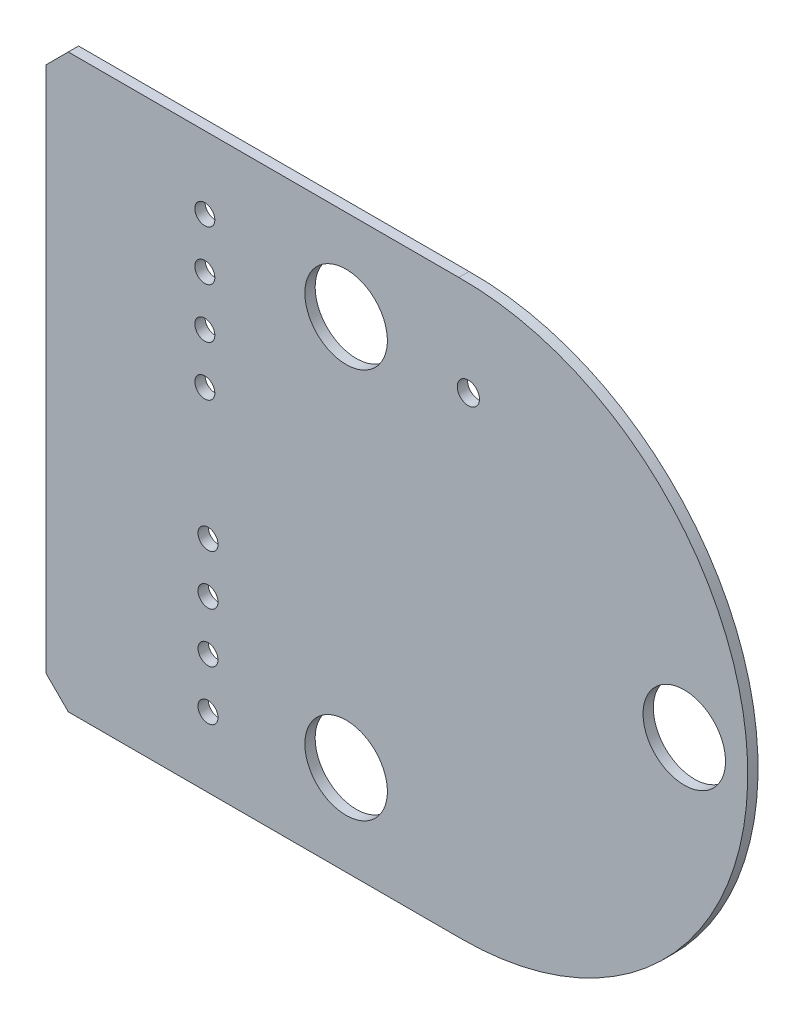
ISO-10303-21;
HEADER;
FILE_DESCRIPTION(('STEP AP214'),'2;1');
FILE_NAME('part.step','',(''),(''),'','','');
FILE_SCHEMA(('AUTOMOTIVE_DESIGN { 1 0 10303 214 1 1 1 1 }'));
ENDSEC;
DATA;
#1=APPLICATION_CONTEXT('core data for automotive mechanical design processes');
#2=APPLICATION_PROTOCOL_DEFINITION('international standard','automotive_design',2000,#1);
#3=PRODUCT_CONTEXT('',#1,'mechanical');
#4=PRODUCT('Part','Part','',(#3));
#5=PRODUCT_RELATED_PRODUCT_CATEGORY('part','',(#4));
#6=PRODUCT_DEFINITION_FORMATION('','',#4);
#7=PRODUCT_DEFINITION_CONTEXT('part definition',#1,'design');
#8=PRODUCT_DEFINITION('design','',#6,#7);
#9=PRODUCT_DEFINITION_SHAPE('','',#8);
#10=(LENGTH_UNIT() NAMED_UNIT(*) SI_UNIT(.MILLI.,.METRE.));
#11=(NAMED_UNIT(*) PLANE_ANGLE_UNIT() SI_UNIT($,.RADIAN.));
#12=(NAMED_UNIT(*) SI_UNIT($,.STERADIAN.) SOLID_ANGLE_UNIT());
#13=UNCERTAINTY_MEASURE_WITH_UNIT(LENGTH_MEASURE(1.E-05),#10,'distance_accuracy_value','');
#14=(GEOMETRIC_REPRESENTATION_CONTEXT(3) GLOBAL_UNCERTAINTY_ASSIGNED_CONTEXT((#13)) GLOBAL_UNIT_ASSIGNED_CONTEXT((#10,
#11,#12)) REPRESENTATION_CONTEXT('',''));
#15=CARTESIAN_POINT('',(0.,0.,0.));
#16=DIRECTION('',(0.,0.,1.));
#17=DIRECTION('',(1.,0.,0.));
#18=AXIS2_PLACEMENT_3D('',#15,#16,#17);
#19=CARTESIAN_POINT('',(78.105,54.229,0.41148));
#20=DIRECTION('',(0.,0.,-1.));
#21=DIRECTION('',(-1.,0.,0.));
#22=AXIS2_PLACEMENT_3D('',#19,#20,#21);
#23=PLANE('',#22);
#24=CARTESIAN_POINT('',(94.996,72.39,0.41148));
#25=DIRECTION('',(0.,0.,-1.));
#26=DIRECTION('',(-1.,0.,0.));
#27=AXIS2_PLACEMENT_3D('',#24,#25,#26);
#28=CIRCLE('',#27,0.4445);
#29=CARTESIAN_POINT('',(94.5515,72.39,0.41148));
#30=VERTEX_POINT('',#29);
#31=EDGE_CURVE('E124',#30,#30,#28,.T.);
#32=ORIENTED_EDGE('',*,*,#31,.T.);
#33=EDGE_LOOP('',(#32));
#34=FACE_BOUND('',#33,.T.);
#35=CARTESIAN_POINT('',(103.632,64.77,0.41148));
#36=DIRECTION('',(0.,0.,-1.));
#37=DIRECTION('',(-1.,0.,0.));
#38=AXIS2_PLACEMENT_3D('',#35,#36,#37);
#39=CIRCLE('',#38,1.64999924);
#40=CARTESIAN_POINT('',(101.98200076,64.77,0.41148));
#41=VERTEX_POINT('',#40);
#42=EDGE_CURVE('E178',#41,#41,#39,.T.);
#43=ORIENTED_EDGE('',*,*,#42,.T.);
#44=EDGE_LOOP('',(#43));
#45=FACE_BOUND('',#44,.T.);
#46=CARTESIAN_POINT('',(90.1065,72.5789506,0.41148));
#47=DIRECTION('',(0.,0.,-1.));
#48=DIRECTION('',(-1.,0.,0.));
#49=AXIS2_PLACEMENT_3D('',#46,#47,#48);
#50=CIRCLE('',#49,1.64999924);
#51=CARTESIAN_POINT('',(88.45650076,72.5789506,0.41148));
#52=VERTEX_POINT('',#51);
#53=EDGE_CURVE('E181',#52,#52,#50,.T.);
#54=ORIENTED_EDGE('',*,*,#53,.T.);
#55=EDGE_LOOP('',(#54));
#56=FACE_BOUND('',#55,.T.);
#57=CARTESIAN_POINT('',(84.582,60.133992,0.41148));
#58=DIRECTION('',(0.,0.,-1.));
#59=DIRECTION('',(-1.,0.,0.));
#60=AXIS2_PLACEMENT_3D('',#57,#58,#59);
#61=CIRCLE('',#60,0.3999992);
#62=CARTESIAN_POINT('',(84.1820008,60.133992,0.41148));
#63=VERTEX_POINT('',#62);
#64=EDGE_CURVE('E184',#63,#63,#61,.T.);
#65=ORIENTED_EDGE('',*,*,#64,.T.);
#66=EDGE_LOOP('',(#65));
#67=FACE_BOUND('',#66,.T.);
#68=CARTESIAN_POINT('',(90.1065,56.9610494,0.41148));
#69=DIRECTION('',(0.,0.,-1.));
#70=DIRECTION('',(-1.,0.,0.));
#71=AXIS2_PLACEMENT_3D('',#68,#69,#70);
#72=CIRCLE('',#71,1.64999924);
#73=CARTESIAN_POINT('',(88.45650076,56.9610494,0.41148));
#74=VERTEX_POINT('',#73);
#75=EDGE_CURVE('E187',#74,#74,#72,.T.);
#76=ORIENTED_EDGE('',*,*,#75,.T.);
#77=EDGE_LOOP('',(#76));
#78=FACE_BOUND('',#77,.T.);
#79=CARTESIAN_POINT('',(84.582,62.133988,0.41148));
#80=DIRECTION('',(0.,0.,-1.));
#81=DIRECTION('',(-1.,0.,0.));
#82=AXIS2_PLACEMENT_3D('',#79,#80,#81);
#83=CIRCLE('',#82,0.3999992);
#84=CARTESIAN_POINT('',(84.1820008,62.133988,0.41148));
#85=VERTEX_POINT('',#84);
#86=EDGE_CURVE('E190',#85,#85,#83,.T.);
#87=ORIENTED_EDGE('',*,*,#86,.T.);
#88=EDGE_LOOP('',(#87));
#89=FACE_BOUND('',#88,.T.);
#90=CARTESIAN_POINT('',(84.455,71.309992,0.41148));
#91=DIRECTION('',(0.,0.,-1.));
#92=DIRECTION('',(-1.,0.,0.));
#93=AXIS2_PLACEMENT_3D('',#90,#91,#92);
#94=CIRCLE('',#93,0.3999992);
#95=CARTESIAN_POINT('',(84.0550008,71.309992,0.41148));
#96=VERTEX_POINT('',#95);
#97=EDGE_CURVE('E193',#96,#96,#94,.T.);
#98=ORIENTED_EDGE('',*,*,#97,.T.);
#99=EDGE_LOOP('',(#98));
#100=FACE_BOUND('',#99,.T.);
#101=CARTESIAN_POINT('',(84.455,69.309996,0.41148));
#102=DIRECTION('',(0.,0.,-1.));
#103=DIRECTION('',(-1.,0.,0.));
#104=AXIS2_PLACEMENT_3D('',#101,#102,#103);
#105=CIRCLE('',#104,0.3999992);
#106=CARTESIAN_POINT('',(84.0550008,69.309996,0.41148));
#107=VERTEX_POINT('',#106);
#108=EDGE_CURVE('E196',#107,#107,#105,.T.);
#109=ORIENTED_EDGE('',*,*,#108,.T.);
#110=EDGE_LOOP('',(#109));
#111=FACE_BOUND('',#110,.T.);
#112=CARTESIAN_POINT('',(84.455,73.309988,0.41148));
#113=DIRECTION('',(0.,0.,-1.));
#114=DIRECTION('',(-1.,0.,0.));
#115=AXIS2_PLACEMENT_3D('',#112,#113,#114);
#116=CIRCLE('',#115,0.3999992);
#117=CARTESIAN_POINT('',(84.0550008,73.309988,0.41148));
#118=VERTEX_POINT('',#117);
#119=EDGE_CURVE('E199',#118,#118,#116,.T.);
#120=ORIENTED_EDGE('',*,*,#119,.T.);
#121=EDGE_LOOP('',(#120));
#122=FACE_BOUND('',#121,.T.);
#123=CARTESIAN_POINT('',(84.582,58.133996,0.41148));
#124=DIRECTION('',(0.,0.,-1.));
#125=DIRECTION('',(-1.,0.,0.));
#126=AXIS2_PLACEMENT_3D('',#123,#124,#125);
#127=CIRCLE('',#126,0.3999992);
#128=CARTESIAN_POINT('',(84.1820008,58.133996,0.41148));
#129=VERTEX_POINT('',#128);
#130=EDGE_CURVE('E202',#129,#129,#127,.T.);
#131=ORIENTED_EDGE('',*,*,#130,.T.);
#132=EDGE_LOOP('',(#131));
#133=FACE_BOUND('',#132,.T.);
#134=CARTESIAN_POINT('',(84.582,56.134,0.41148));
#135=DIRECTION('',(0.,0.,-1.));
#136=DIRECTION('',(-1.,0.,0.));
#137=AXIS2_PLACEMENT_3D('',#134,#135,#136);
#138=CIRCLE('',#137,0.3999992);
#139=CARTESIAN_POINT('',(84.1820008,56.134,0.41148));
#140=VERTEX_POINT('',#139);
#141=EDGE_CURVE('E205',#140,#140,#138,.T.);
#142=ORIENTED_EDGE('',*,*,#141,.T.);
#143=EDGE_LOOP('',(#142));
#144=FACE_BOUND('',#143,.T.);
#145=CARTESIAN_POINT('',(84.455,67.31,0.41148));
#146=DIRECTION('',(0.,0.,-1.));
#147=DIRECTION('',(-1.,0.,0.));
#148=AXIS2_PLACEMENT_3D('',#145,#146,#147);
#149=CIRCLE('',#148,0.3999992);
#150=CARTESIAN_POINT('',(84.0550008,67.31,0.41148));
#151=VERTEX_POINT('',#150);
#152=EDGE_CURVE('E101',#151,#151,#149,.T.);
#153=ORIENTED_EDGE('',*,*,#152,.T.);
#154=EDGE_LOOP('',(#153));
#155=FACE_BOUND('',#154,.T.);
#156=DIRECTION('',(1.,0.,0.));
#157=VECTOR('',#156,1.);
#158=CARTESIAN_POINT('',(78.994,53.34,0.41148));
#159=LINE('',#158,#157);
#160=CARTESIAN_POINT('',(78.994,53.34,0.41148));
#161=VERTEX_POINT('',#160);
#162=CARTESIAN_POINT('',(94.7420030007095,53.34,0.41148));
#163=VERTEX_POINT('',#162);
#164=EDGE_CURVE('E70',#161,#163,#159,.T.);
#165=ORIENTED_EDGE('',*,*,#164,.T.);
#166=CARTESIAN_POINT('',(94.742006001419,64.769993001131,0.41148));
#167=DIRECTION('',(0.,0.,-1.));
#168=DIRECTION('',(-1.,0.,0.));
#169=AXIS2_PLACEMENT_3D('',#166,#167,#168);
#170=CIRCLE('',#169,11.429993001133);
#171=CARTESIAN_POINT('',(94.6157619999793,76.1992888000002,0.41148));
#172=VERTEX_POINT('',#171);
#173=EDGE_CURVE('E19',#172,#163,#170,.T.);
#174=ORIENTED_EDGE('',*,*,#173,.F.);
#175=DIRECTION('',(1.,0.,0.));
#176=VECTOR('',#175,1.);
#177=CARTESIAN_POINT('',(94.615762,76.1992888,0.41148));
#178=LINE('',#177,#176);
#179=CARTESIAN_POINT('',(78.9932888,76.1992888,0.41148));
#180=VERTEX_POINT('',#179);
#181=EDGE_CURVE('E66',#172,#180,#178,.F.);
#182=ORIENTED_EDGE('',*,*,#181,.T.);
#183=DIRECTION('',(0.707106781186548,0.707106781186548,0.));
#184=VECTOR('',#183,1.);
#185=CARTESIAN_POINT('',(78.9932888,76.1992888,0.41148));
#186=LINE('',#185,#184);
#187=CARTESIAN_POINT('',(78.105,75.311,0.41148));
#188=VERTEX_POINT('',#187);
#189=EDGE_CURVE('E118',#180,#188,#186,.F.);
#190=ORIENTED_EDGE('',*,*,#189,.T.);
#191=DIRECTION('',(0.,1.,0.));
#192=VECTOR('',#191,1.);
#193=CARTESIAN_POINT('',(78.105,75.311,0.41148));
#194=LINE('',#193,#192);
#195=CARTESIAN_POINT('',(78.105,54.229,0.41148));
#196=VERTEX_POINT('',#195);
#197=EDGE_CURVE('E119',#188,#196,#194,.F.);
#198=ORIENTED_EDGE('',*,*,#197,.T.);
#199=DIRECTION('',(-0.707106781186548,0.707106781186548,0.));
#200=VECTOR('',#199,1.);
#201=CARTESIAN_POINT('',(78.105,54.229,0.41148));
#202=LINE('',#201,#200);
#203=EDGE_CURVE('E74',#196,#161,#202,.F.);
#204=ORIENTED_EDGE('',*,*,#203,.T.);
#205=EDGE_LOOP('',(#165,#174,#182,#190,#198,#204));
#206=FACE_BOUND('',#205,.T.);
#207=ADVANCED_FACE('F16',(#34,#45,#56,#67,#78,#89,#100,#111,#122,#133,#144,#155,#206),#23,.F.);
#208=CARTESIAN_POINT('',(78.105,75.311,0.));
#209=DIRECTION('',(1.,0.,0.));
#210=DIRECTION('',(0.,0.,-1.));
#211=AXIS2_PLACEMENT_3D('',#208,#209,#210);
#212=PLANE('',#211);
#213=DIRECTION('',(0.,0.,1.));
#214=VECTOR('',#213,1.);
#215=CARTESIAN_POINT('',(78.105,54.229,0.));
#216=LINE('',#215,#214);
#217=CARTESIAN_POINT('',(78.105,54.229,0.));
#218=VERTEX_POINT('',#217);
#219=EDGE_CURVE('E86',#218,#196,#216,.T.);
#220=ORIENTED_EDGE('',*,*,#219,.T.);
#221=ORIENTED_EDGE('',*,*,#197,.F.);
#222=DIRECTION('',(0.,0.,1.));
#223=VECTOR('',#222,1.);
#224=CARTESIAN_POINT('',(78.105,75.311,0.));
#225=LINE('',#224,#223);
#226=CARTESIAN_POINT('',(78.105,75.311,0.));
#227=VERTEX_POINT('',#226);
#228=EDGE_CURVE('E116',#188,#227,#225,.F.);
#229=ORIENTED_EDGE('',*,*,#228,.T.);
#230=DIRECTION('',(0.,1.,0.));
#231=VECTOR('',#230,1.);
#232=CARTESIAN_POINT('',(78.105,54.229,0.));
#233=LINE('',#232,#231);
#234=EDGE_CURVE('E113',#218,#227,#233,.T.);
#235=ORIENTED_EDGE('',*,*,#234,.F.);
#236=EDGE_LOOP('',(#220,#221,#229,#235));
#237=FACE_BOUND('',#236,.T.);
#238=ADVANCED_FACE('F238',(#237),#212,.F.);
#239=CARTESIAN_POINT('',(78.9932888,76.1992888,0.));
#240=DIRECTION('',(0.707106781186548,-0.707106781186548,0.));
#241=DIRECTION('',(0.707106781186548,0.707106781186548,0.));
#242=AXIS2_PLACEMENT_3D('',#239,#240,#241);
#243=PLANE('',#242);
#244=DIRECTION('',(0.,0.,-1.));
#245=VECTOR('',#244,1.);
#246=CARTESIAN_POINT('',(78.9932888,76.1992888,0.));
#247=LINE('',#246,#245);
#248=CARTESIAN_POINT('',(78.9932888,76.1992888,0.));
#249=VERTEX_POINT('',#248);
#250=EDGE_CURVE('E105',#180,#249,#247,.T.);
#251=ORIENTED_EDGE('',*,*,#250,.T.);
#252=DIRECTION('',(0.70710678118654,0.707106781186555,0.));
#253=VECTOR('',#252,1.);
#254=CARTESIAN_POINT('',(78.105,75.311,0.));
#255=LINE('',#254,#253);
#256=EDGE_CURVE('E110',#227,#249,#255,.T.);
#257=ORIENTED_EDGE('',*,*,#256,.F.);
#258=ORIENTED_EDGE('',*,*,#228,.F.);
#259=ORIENTED_EDGE('',*,*,#189,.F.);
#260=EDGE_LOOP('',(#251,#257,#258,#259));
#261=FACE_BOUND('',#260,.T.);
#262=ADVANCED_FACE('F234',(#261),#243,.F.);
#263=CARTESIAN_POINT('',(94.615762,76.1992888,0.));
#264=DIRECTION('',(0.,-1.,0.));
#265=DIRECTION('',(0.,0.,-1.));
#266=AXIS2_PLACEMENT_3D('',#263,#264,#265);
#267=PLANE('',#266);
#268=ORIENTED_EDGE('',*,*,#250,.F.);
#269=ORIENTED_EDGE('',*,*,#181,.F.);
#270=DIRECTION('',(0.,0.,-1.));
#271=VECTOR('',#270,1.);
#272=CARTESIAN_POINT('',(94.615762,76.1992888000005,0.));
#273=LINE('',#272,#271);
#274=CARTESIAN_POINT('',(94.6157619999793,76.1992888000002,0.));
#275=VERTEX_POINT('',#274);
#276=EDGE_CURVE('E81',#275,#172,#273,.F.);
#277=ORIENTED_EDGE('',*,*,#276,.F.);
#278=DIRECTION('',(-1.,0.,0.));
#279=VECTOR('',#278,1.);
#280=CARTESIAN_POINT('',(78.105,76.1992888,0.));
#281=LINE('',#280,#279);
#282=EDGE_CURVE('E112',#249,#275,#281,.F.);
#283=ORIENTED_EDGE('',*,*,#282,.F.);
#284=EDGE_LOOP('',(#268,#269,#277,#283));
#285=FACE_BOUND('',#284,.T.);
#286=ADVANCED_FACE('F231',(#285),#267,.F.);
#287=CARTESIAN_POINT('',(94.742006001419,64.769993001131,0.));
#288=DIRECTION('',(0.,0.,-1.));
#289=DIRECTION('',(-1.,0.,0.));
#290=AXIS2_PLACEMENT_3D('',#287,#288,#289);
#291=CYLINDRICAL_SURFACE('',#290,11.429993001133);
#292=ORIENTED_EDGE('',*,*,#173,.T.);
#293=DIRECTION('',(0.,0.,1.));
#294=VECTOR('',#293,1.);
#295=CARTESIAN_POINT('',(94.742,53.34,0.));
#296=LINE('',#295,#294);
#297=CARTESIAN_POINT('',(94.7420030007095,53.34,0.));
#298=VERTEX_POINT('',#297);
#299=EDGE_CURVE('E76',#163,#298,#296,.F.);
#300=ORIENTED_EDGE('',*,*,#299,.T.);
#301=CARTESIAN_POINT('',(94.742006001419,64.769993001131,0.));
#302=DIRECTION('',(0.,0.,-1.));
#303=DIRECTION('',(-1.,0.,0.));
#304=AXIS2_PLACEMENT_3D('',#301,#302,#303);
#305=CIRCLE('',#304,11.429993001133);
#306=EDGE_CURVE('E174',#275,#298,#305,.T.);
#307=ORIENTED_EDGE('',*,*,#306,.F.);
#308=ORIENTED_EDGE('',*,*,#276,.T.);
#309=EDGE_LOOP('',(#292,#300,#307,#308));
#310=FACE_BOUND('',#309,.T.);
#311=ADVANCED_FACE('F79',(#310),#291,.T.);
#312=CARTESIAN_POINT('',(78.994,53.34,0.));
#313=DIRECTION('',(0.,1.,0.));
#314=DIRECTION('',(0.,0.,1.));
#315=AXIS2_PLACEMENT_3D('',#312,#313,#314);
#316=PLANE('',#315);
#317=ORIENTED_EDGE('',*,*,#299,.F.);
#318=ORIENTED_EDGE('',*,*,#164,.F.);
#319=DIRECTION('',(0.,0.,1.));
#320=VECTOR('',#319,1.);
#321=CARTESIAN_POINT('',(78.994,53.34,0.));
#322=LINE('',#321,#320);
#323=CARTESIAN_POINT('',(78.994,53.34,0.));
#324=VERTEX_POINT('',#323);
#325=EDGE_CURVE('E34',#161,#324,#322,.F.);
#326=ORIENTED_EDGE('',*,*,#325,.T.);
#327=DIRECTION('',(-1.,0.,0.));
#328=VECTOR('',#327,1.);
#329=CARTESIAN_POINT('',(78.105,53.34,0.));
#330=LINE('',#329,#328);
#331=EDGE_CURVE('E84',#298,#324,#330,.T.);
#332=ORIENTED_EDGE('',*,*,#331,.F.);
#333=EDGE_LOOP('',(#317,#318,#326,#332));
#334=FACE_BOUND('',#333,.T.);
#335=ADVANCED_FACE('F82',(#334),#316,.F.);
#336=CARTESIAN_POINT('',(78.105,54.229,0.));
#337=DIRECTION('',(0.707106781186548,0.707106781186548,0.));
#338=DIRECTION('',(-0.707106781186548,0.707106781186548,0.));
#339=AXIS2_PLACEMENT_3D('',#336,#337,#338);
#340=PLANE('',#339);
#341=ORIENTED_EDGE('',*,*,#325,.F.);
#342=ORIENTED_EDGE('',*,*,#203,.F.);
#343=ORIENTED_EDGE('',*,*,#219,.F.);
#344=DIRECTION('',(-0.707106781186545,0.70710678118655,0.));
#345=VECTOR('',#344,1.);
#346=CARTESIAN_POINT('',(78.994,53.34,0.));
#347=LINE('',#346,#345);
#348=EDGE_CURVE('E94',#324,#218,#347,.T.);
#349=ORIENTED_EDGE('',*,*,#348,.F.);
#350=EDGE_LOOP('',(#341,#342,#343,#349));
#351=FACE_BOUND('',#350,.T.);
#352=ADVANCED_FACE('F215',(#351),#340,.F.);
#353=CARTESIAN_POINT('',(84.455,67.31,0.));
#354=DIRECTION('',(0.,0.,-1.));
#355=DIRECTION('',(-1.,0.,0.));
#356=AXIS2_PLACEMENT_3D('',#353,#354,#355);
#357=CYLINDRICAL_SURFACE('',#356,0.3999992);
#358=ORIENTED_EDGE('',*,*,#152,.F.);
#359=EDGE_LOOP('',(#358));
#360=FACE_BOUND('',#359,.T.);
#361=CARTESIAN_POINT('',(84.455,67.31,0.));
#362=DIRECTION('',(0.,0.,-1.));
#363=DIRECTION('',(-1.,0.,0.));
#364=AXIS2_PLACEMENT_3D('',#361,#362,#363);
#365=CIRCLE('',#364,0.3999992);
#366=CARTESIAN_POINT('',(84.0550008,67.31,0.));
#367=VERTEX_POINT('',#366);
#368=EDGE_CURVE('E97',#367,#367,#365,.F.);
#369=ORIENTED_EDGE('',*,*,#368,.F.);
#370=EDGE_LOOP('',(#369));
#371=FACE_BOUND('',#370,.T.);
#372=ADVANCED_FACE('F211',(#360,#371),#357,.F.);
#373=CARTESIAN_POINT('',(84.582,56.134,0.));
#374=DIRECTION('',(0.,0.,-1.));
#375=DIRECTION('',(-1.,0.,0.));
#376=AXIS2_PLACEMENT_3D('',#373,#374,#375);
#377=CYLINDRICAL_SURFACE('',#376,0.3999992);
#378=ORIENTED_EDGE('',*,*,#141,.F.);
#379=EDGE_LOOP('',(#378));
#380=FACE_BOUND('',#379,.T.);
#381=CARTESIAN_POINT('',(84.582,56.134,0.));
#382=DIRECTION('',(0.,0.,-1.));
#383=DIRECTION('',(-1.,0.,0.));
#384=AXIS2_PLACEMENT_3D('',#381,#382,#383);
#385=CIRCLE('',#384,0.3999992);
#386=CARTESIAN_POINT('',(84.1820008,56.134,0.));
#387=VERTEX_POINT('',#386);
#388=EDGE_CURVE('E169',#387,#387,#385,.F.);
#389=ORIENTED_EDGE('',*,*,#388,.F.);
#390=EDGE_LOOP('',(#389));
#391=FACE_BOUND('',#390,.T.);
#392=ADVANCED_FACE('F214',(#380,#391),#377,.F.);
#393=CARTESIAN_POINT('',(84.582,58.133996,0.));
#394=DIRECTION('',(0.,0.,-1.));
#395=DIRECTION('',(-1.,0.,0.));
#396=AXIS2_PLACEMENT_3D('',#393,#394,#395);
#397=CYLINDRICAL_SURFACE('',#396,0.3999992);
#398=ORIENTED_EDGE('',*,*,#130,.F.);
#399=EDGE_LOOP('',(#398));
#400=FACE_BOUND('',#399,.T.);
#401=CARTESIAN_POINT('',(84.582,58.133996,0.));
#402=DIRECTION('',(0.,0.,-1.));
#403=DIRECTION('',(-1.,0.,0.));
#404=AXIS2_PLACEMENT_3D('',#401,#402,#403);
#405=CIRCLE('',#404,0.3999992);
#406=CARTESIAN_POINT('',(84.1820008,58.133996,0.));
#407=VERTEX_POINT('',#406);
#408=EDGE_CURVE('E166',#407,#407,#405,.F.);
#409=ORIENTED_EDGE('',*,*,#408,.F.);
#410=EDGE_LOOP('',(#409));
#411=FACE_BOUND('',#410,.T.);
#412=ADVANCED_FACE('F286',(#400,#411),#397,.F.);
#413=CARTESIAN_POINT('',(84.455,73.309988,0.));
#414=DIRECTION('',(0.,0.,-1.));
#415=DIRECTION('',(-1.,0.,0.));
#416=AXIS2_PLACEMENT_3D('',#413,#414,#415);
#417=CYLINDRICAL_SURFACE('',#416,0.3999992);
#418=ORIENTED_EDGE('',*,*,#119,.F.);
#419=EDGE_LOOP('',(#418));
#420=FACE_BOUND('',#419,.T.);
#421=CARTESIAN_POINT('',(84.455,73.309988,0.));
#422=DIRECTION('',(0.,0.,-1.));
#423=DIRECTION('',(-1.,0.,0.));
#424=AXIS2_PLACEMENT_3D('',#421,#422,#423);
#425=CIRCLE('',#424,0.3999992);
#426=CARTESIAN_POINT('',(84.0550008,73.309988,0.));
#427=VERTEX_POINT('',#426);
#428=EDGE_CURVE('E163',#427,#427,#425,.F.);
#429=ORIENTED_EDGE('',*,*,#428,.F.);
#430=EDGE_LOOP('',(#429));
#431=FACE_BOUND('',#430,.T.);
#432=ADVANCED_FACE('F292',(#420,#431),#417,.F.);
#433=CARTESIAN_POINT('',(84.455,69.309996,0.));
#434=DIRECTION('',(0.,0.,-1.));
#435=DIRECTION('',(-1.,0.,0.));
#436=AXIS2_PLACEMENT_3D('',#433,#434,#435);
#437=CYLINDRICAL_SURFACE('',#436,0.3999992);
#438=ORIENTED_EDGE('',*,*,#108,.F.);
#439=EDGE_LOOP('',(#438));
#440=FACE_BOUND('',#439,.T.);
#441=CARTESIAN_POINT('',(84.455,69.309996,0.));
#442=DIRECTION('',(0.,0.,-1.));
#443=DIRECTION('',(-1.,0.,0.));
#444=AXIS2_PLACEMENT_3D('',#441,#442,#443);
#445=CIRCLE('',#444,0.3999992);
#446=CARTESIAN_POINT('',(84.0550008,69.309996,0.));
#447=VERTEX_POINT('',#446);
#448=EDGE_CURVE('E160',#447,#447,#445,.F.);
#449=ORIENTED_EDGE('',*,*,#448,.F.);
#450=EDGE_LOOP('',(#449));
#451=FACE_BOUND('',#450,.T.);
#452=ADVANCED_FACE('F298',(#440,#451),#437,.F.);
#453=CARTESIAN_POINT('',(84.455,71.309992,0.));
#454=DIRECTION('',(0.,0.,-1.));
#455=DIRECTION('',(-1.,0.,0.));
#456=AXIS2_PLACEMENT_3D('',#453,#454,#455);
#457=CYLINDRICAL_SURFACE('',#456,0.3999992);
#458=ORIENTED_EDGE('',*,*,#97,.F.);
#459=EDGE_LOOP('',(#458));
#460=FACE_BOUND('',#459,.T.);
#461=CARTESIAN_POINT('',(84.455,71.309992,0.));
#462=DIRECTION('',(0.,0.,-1.));
#463=DIRECTION('',(-1.,0.,0.));
#464=AXIS2_PLACEMENT_3D('',#461,#462,#463);
#465=CIRCLE('',#464,0.3999992);
#466=CARTESIAN_POINT('',(84.0550008,71.309992,0.));
#467=VERTEX_POINT('',#466);
#468=EDGE_CURVE('E157',#467,#467,#465,.F.);
#469=ORIENTED_EDGE('',*,*,#468,.F.);
#470=EDGE_LOOP('',(#469));
#471=FACE_BOUND('',#470,.T.);
#472=ADVANCED_FACE('F302',(#460,#471),#457,.F.);
#473=CARTESIAN_POINT('',(84.582,62.133988,0.));
#474=DIRECTION('',(0.,0.,-1.));
#475=DIRECTION('',(-1.,0.,0.));
#476=AXIS2_PLACEMENT_3D('',#473,#474,#475);
#477=CYLINDRICAL_SURFACE('',#476,0.3999992);
#478=ORIENTED_EDGE('',*,*,#86,.F.);
#479=EDGE_LOOP('',(#478));
#480=FACE_BOUND('',#479,.T.);
#481=CARTESIAN_POINT('',(84.582,62.133988,0.));
#482=DIRECTION('',(0.,0.,-1.));
#483=DIRECTION('',(-1.,0.,0.));
#484=AXIS2_PLACEMENT_3D('',#481,#482,#483);
#485=CIRCLE('',#484,0.3999992);
#486=CARTESIAN_POINT('',(84.1820008,62.133988,0.));
#487=VERTEX_POINT('',#486);
#488=EDGE_CURVE('E154',#487,#487,#485,.F.);
#489=ORIENTED_EDGE('',*,*,#488,.F.);
#490=EDGE_LOOP('',(#489));
#491=FACE_BOUND('',#490,.T.);
#492=ADVANCED_FACE('F306',(#480,#491),#477,.F.);
#493=CARTESIAN_POINT('',(90.1065,56.9610494,0.));
#494=DIRECTION('',(0.,0.,-1.));
#495=DIRECTION('',(-1.,0.,0.));
#496=AXIS2_PLACEMENT_3D('',#493,#494,#495);
#497=CYLINDRICAL_SURFACE('',#496,1.64999924);
#498=ORIENTED_EDGE('',*,*,#75,.F.);
#499=EDGE_LOOP('',(#498));
#500=FACE_BOUND('',#499,.T.);
#501=CARTESIAN_POINT('',(90.1065,56.9610494,0.));
#502=DIRECTION('',(0.,0.,-1.));
#503=DIRECTION('',(-1.,0.,0.));
#504=AXIS2_PLACEMENT_3D('',#501,#502,#503);
#505=CIRCLE('',#504,1.64999924);
#506=CARTESIAN_POINT('',(88.45650076,56.9610494,0.));
#507=VERTEX_POINT('',#506);
#508=EDGE_CURVE('E151',#507,#507,#505,.F.);
#509=ORIENTED_EDGE('',*,*,#508,.F.);
#510=EDGE_LOOP('',(#509));
#511=FACE_BOUND('',#510,.T.);
#512=ADVANCED_FACE('F310',(#500,#511),#497,.F.);
#513=CARTESIAN_POINT('',(84.582,60.133992,0.));
#514=DIRECTION('',(0.,0.,-1.));
#515=DIRECTION('',(-1.,0.,0.));
#516=AXIS2_PLACEMENT_3D('',#513,#514,#515);
#517=CYLINDRICAL_SURFACE('',#516,0.3999992);
#518=ORIENTED_EDGE('',*,*,#64,.F.);
#519=EDGE_LOOP('',(#518));
#520=FACE_BOUND('',#519,.T.);
#521=CARTESIAN_POINT('',(84.582,60.133992,0.));
#522=DIRECTION('',(0.,0.,-1.));
#523=DIRECTION('',(-1.,0.,0.));
#524=AXIS2_PLACEMENT_3D('',#521,#522,#523);
#525=CIRCLE('',#524,0.3999992);
#526=CARTESIAN_POINT('',(84.1820008,60.133992,0.));
#527=VERTEX_POINT('',#526);
#528=EDGE_CURVE('E148',#527,#527,#525,.F.);
#529=ORIENTED_EDGE('',*,*,#528,.F.);
#530=EDGE_LOOP('',(#529));
#531=FACE_BOUND('',#530,.T.);
#532=ADVANCED_FACE('F314',(#520,#531),#517,.F.);
#533=CARTESIAN_POINT('',(90.1065,72.5789506,0.));
#534=DIRECTION('',(0.,0.,-1.));
#535=DIRECTION('',(-1.,0.,0.));
#536=AXIS2_PLACEMENT_3D('',#533,#534,#535);
#537=CYLINDRICAL_SURFACE('',#536,1.64999924);
#538=ORIENTED_EDGE('',*,*,#53,.F.);
#539=EDGE_LOOP('',(#538));
#540=FACE_BOUND('',#539,.T.);
#541=CARTESIAN_POINT('',(90.1065,72.5789506,0.));
#542=DIRECTION('',(0.,0.,-1.));
#543=DIRECTION('',(-1.,0.,0.));
#544=AXIS2_PLACEMENT_3D('',#541,#542,#543);
#545=CIRCLE('',#544,1.64999924);
#546=CARTESIAN_POINT('',(88.45650076,72.5789506,0.));
#547=VERTEX_POINT('',#546);
#548=EDGE_CURVE('E145',#547,#547,#545,.F.);
#549=ORIENTED_EDGE('',*,*,#548,.F.);
#550=EDGE_LOOP('',(#549));
#551=FACE_BOUND('',#550,.T.);
#552=ADVANCED_FACE('F318',(#540,#551),#537,.F.);
#553=CARTESIAN_POINT('',(103.632,64.77,0.));
#554=DIRECTION('',(0.,0.,-1.));
#555=DIRECTION('',(-1.,0.,0.));
#556=AXIS2_PLACEMENT_3D('',#553,#554,#555);
#557=CYLINDRICAL_SURFACE('',#556,1.64999924);
#558=ORIENTED_EDGE('',*,*,#42,.F.);
#559=EDGE_LOOP('',(#558));
#560=FACE_BOUND('',#559,.T.);
#561=CARTESIAN_POINT('',(103.632,64.77,0.));
#562=DIRECTION('',(0.,0.,-1.));
#563=DIRECTION('',(-1.,0.,0.));
#564=AXIS2_PLACEMENT_3D('',#561,#562,#563);
#565=CIRCLE('',#564,1.64999924);
#566=CARTESIAN_POINT('',(101.98200076,64.77,0.));
#567=VERTEX_POINT('',#566);
#568=EDGE_CURVE('E25',#567,#567,#565,.F.);
#569=ORIENTED_EDGE('',*,*,#568,.F.);
#570=EDGE_LOOP('',(#569));
#571=FACE_BOUND('',#570,.T.);
#572=ADVANCED_FACE('F322',(#560,#571),#557,.F.);
#573=CARTESIAN_POINT('',(94.996,72.39,0.));
#574=DIRECTION('',(0.,0.,-1.));
#575=DIRECTION('',(-1.,0.,0.));
#576=AXIS2_PLACEMENT_3D('',#573,#574,#575);
#577=CYLINDRICAL_SURFACE('',#576,0.4445);
#578=ORIENTED_EDGE('',*,*,#31,.F.);
#579=EDGE_LOOP('',(#578));
#580=FACE_BOUND('',#579,.T.);
#581=CARTESIAN_POINT('',(94.996,72.39,0.));
#582=DIRECTION('',(0.,0.,-1.));
#583=DIRECTION('',(-1.,0.,0.));
#584=AXIS2_PLACEMENT_3D('',#581,#582,#583);
#585=CIRCLE('',#584,0.4445);
#586=CARTESIAN_POINT('',(94.5515,72.39,0.));
#587=VERTEX_POINT('',#586);
#588=EDGE_CURVE('E11',#587,#587,#585,.F.);
#589=ORIENTED_EDGE('',*,*,#588,.F.);
#590=EDGE_LOOP('',(#589));
#591=FACE_BOUND('',#590,.T.);
#592=ADVANCED_FACE('F222',(#580,#591),#577,.F.);
#593=CARTESIAN_POINT('',(78.105,54.229,0.));
#594=DIRECTION('',(0.,0.,-1.));
#595=DIRECTION('',(-1.,0.,0.));
#596=AXIS2_PLACEMENT_3D('',#593,#594,#595);
#597=PLANE('',#596);
#598=ORIENTED_EDGE('',*,*,#588,.T.);
#599=EDGE_LOOP('',(#598));
#600=FACE_BOUND('',#599,.T.);
#601=ORIENTED_EDGE('',*,*,#568,.T.);
#602=EDGE_LOOP('',(#601));
#603=FACE_BOUND('',#602,.T.);
#604=ORIENTED_EDGE('',*,*,#548,.T.);
#605=EDGE_LOOP('',(#604));
#606=FACE_BOUND('',#605,.T.);
#607=ORIENTED_EDGE('',*,*,#528,.T.);
#608=EDGE_LOOP('',(#607));
#609=FACE_BOUND('',#608,.T.);
#610=ORIENTED_EDGE('',*,*,#508,.T.);
#611=EDGE_LOOP('',(#610));
#612=FACE_BOUND('',#611,.T.);
#613=ORIENTED_EDGE('',*,*,#488,.T.);
#614=EDGE_LOOP('',(#613));
#615=FACE_BOUND('',#614,.T.);
#616=ORIENTED_EDGE('',*,*,#468,.T.);
#617=EDGE_LOOP('',(#616));
#618=FACE_BOUND('',#617,.T.);
#619=ORIENTED_EDGE('',*,*,#448,.T.);
#620=EDGE_LOOP('',(#619));
#621=FACE_BOUND('',#620,.T.);
#622=ORIENTED_EDGE('',*,*,#428,.T.);
#623=EDGE_LOOP('',(#622));
#624=FACE_BOUND('',#623,.T.);
#625=ORIENTED_EDGE('',*,*,#408,.T.);
#626=EDGE_LOOP('',(#625));
#627=FACE_BOUND('',#626,.T.);
#628=ORIENTED_EDGE('',*,*,#388,.T.);
#629=EDGE_LOOP('',(#628));
#630=FACE_BOUND('',#629,.T.);
#631=ORIENTED_EDGE('',*,*,#368,.T.);
#632=EDGE_LOOP('',(#631));
#633=FACE_BOUND('',#632,.T.);
#634=ORIENTED_EDGE('',*,*,#331,.T.);
#635=ORIENTED_EDGE('',*,*,#348,.T.);
#636=ORIENTED_EDGE('',*,*,#234,.T.);
#637=ORIENTED_EDGE('',*,*,#256,.T.);
#638=ORIENTED_EDGE('',*,*,#282,.T.);
#639=ORIENTED_EDGE('',*,*,#306,.T.);
#640=EDGE_LOOP('',(#634,#635,#636,#637,#638,#639));
#641=FACE_BOUND('',#640,.T.);
#642=ADVANCED_FACE('F219',(#600,#603,#606,#609,#612,#615,#618,#621,#624,#627,#630,#633,#641),
#597,.T.);
#643=CLOSED_SHELL('',(#207,#238,#262,#286,#311,#335,#352,#372,#392,#412,#432,#452,#472,#492,
#512,#532,#552,#572,#592,#642));
#644=MANIFOLD_SOLID_BREP('B1',#643);
#645=ADVANCED_BREP_SHAPE_REPRESENTATION('',(#18,#644),#14);
#646=SHAPE_DEFINITION_REPRESENTATION(#9,#645);
ENDSEC;
END-ISO-10303-21;
